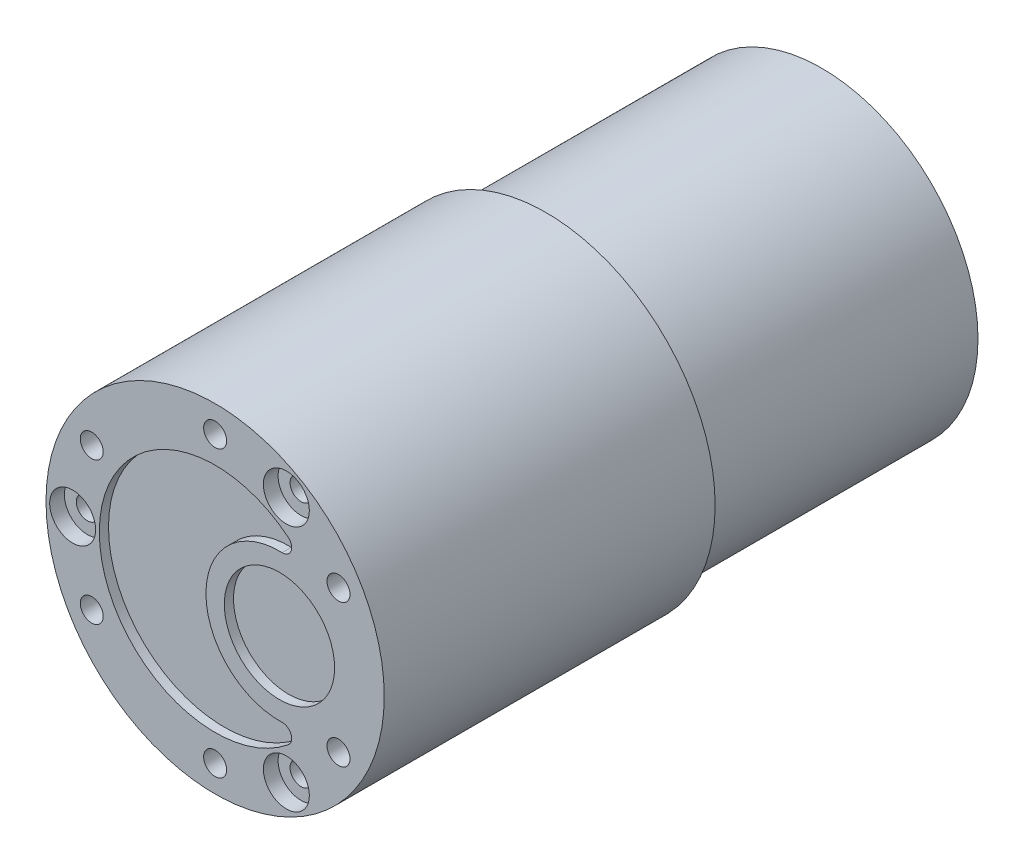
ISO-10303-21;
HEADER;
FILE_DESCRIPTION(('STEP AP214'),'2;1');
FILE_NAME('part.step','',(''),(''),'','','');
FILE_SCHEMA(('AUTOMOTIVE_DESIGN { 1 0 10303 214 1 1 1 1 }'));
ENDSEC;
DATA;
#1=APPLICATION_CONTEXT('core data for automotive mechanical design processes');
#2=APPLICATION_PROTOCOL_DEFINITION('international standard','automotive_design',2000,#1);
#3=PRODUCT_CONTEXT('',#1,'mechanical');
#4=PRODUCT('Part','Part','',(#3));
#5=PRODUCT_RELATED_PRODUCT_CATEGORY('part','',(#4));
#6=PRODUCT_DEFINITION_FORMATION('','',#4);
#7=PRODUCT_DEFINITION_CONTEXT('part definition',#1,'design');
#8=PRODUCT_DEFINITION('design','',#6,#7);
#9=PRODUCT_DEFINITION_SHAPE('','',#8);
#10=(LENGTH_UNIT() NAMED_UNIT(*) SI_UNIT(.MILLI.,.METRE.));
#11=(NAMED_UNIT(*) PLANE_ANGLE_UNIT() SI_UNIT($,.RADIAN.));
#12=(NAMED_UNIT(*) SI_UNIT($,.STERADIAN.) SOLID_ANGLE_UNIT());
#13=UNCERTAINTY_MEASURE_WITH_UNIT(LENGTH_MEASURE(1.E-05),#10,'distance_accuracy_value','');
#14=(GEOMETRIC_REPRESENTATION_CONTEXT(3) GLOBAL_UNCERTAINTY_ASSIGNED_CONTEXT((#13)) GLOBAL_UNIT_ASSIGNED_CONTEXT((#10,
#11,#12)) REPRESENTATION_CONTEXT('',''));
#15=CARTESIAN_POINT('',(0.,0.,0.));
#16=DIRECTION('',(0.,0.,1.));
#17=DIRECTION('',(1.,0.,0.));
#18=AXIS2_PLACEMENT_3D('',#15,#16,#17);
#19=CARTESIAN_POINT('',(0.,18.4,33.5));
#20=DIRECTION('',(0.,0.,-1.));
#21=DIRECTION('',(-1.,0.,0.));
#22=AXIS2_PLACEMENT_3D('',#19,#20,#21);
#23=PLANE('',#22);
#24=CARTESIAN_POINT('',(7.,0.,33.5));
#25=DIRECTION('',(0.,0.,1.));
#26=DIRECTION('',(1.,0.,0.));
#27=AXIS2_PLACEMENT_3D('',#24,#25,#26);
#28=CIRCLE('',#27,6.);
#29=CARTESIAN_POINT('',(13.,0.,33.5));
#30=VERTEX_POINT('',#29);
#31=EDGE_CURVE('E133',#30,#30,#28,.T.);
#32=ORIENTED_EDGE('',*,*,#31,.F.);
#33=EDGE_LOOP('',(#32));
#34=FACE_BOUND('',#33,.T.);
#35=CARTESIAN_POINT('',(0.,0.,33.5));
#36=DIRECTION('',(0.,0.,1.));
#37=DIRECTION('',(1.,0.,0.));
#38=AXIS2_PLACEMENT_3D('',#35,#36,#37);
#39=CIRCLE('',#38,12.6);
#40=CARTESIAN_POINT('',(7.95724137931039,9.76945800090215,33.5));
#41=VERTEX_POINT('',#40);
#42=CARTESIAN_POINT('',(7.95724137931039,-9.76945800090215,33.5));
#43=VERTEX_POINT('',#42);
#44=EDGE_CURVE('E139',#41,#43,#39,.T.);
#45=ORIENTED_EDGE('',*,*,#44,.F.);
#46=CARTESIAN_POINT('',(7.32571428571432,8.99410419130675,33.5));
#47=DIRECTION('',(0.,0.,1.));
#48=DIRECTION('',(1.,0.,0.));
#49=AXIS2_PLACEMENT_3D('',#46,#47,#48);
#50=CIRCLE('',#49,1.);
#51=CARTESIAN_POINT('',(7.28952380952385,7.99475928116155,33.5));
#52=VERTEX_POINT('',#51);
#53=EDGE_CURVE('E57',#52,#41,#50,.T.);
#54=ORIENTED_EDGE('',*,*,#53,.F.);
#55=CARTESIAN_POINT('',(7.,0.,33.5));
#56=DIRECTION('',(0.,0.,-1.));
#57=DIRECTION('',(-1.,0.,0.));
#58=AXIS2_PLACEMENT_3D('',#55,#56,#57);
#59=CIRCLE('',#58,8.);
#60=CARTESIAN_POINT('',(7.28952380952385,-7.99475928116155,33.5));
#61=VERTEX_POINT('',#60);
#62=EDGE_CURVE('E127',#61,#52,#59,.T.);
#63=ORIENTED_EDGE('',*,*,#62,.F.);
#64=CARTESIAN_POINT('',(7.32571428571432,-8.99410419130675,33.5));
#65=DIRECTION('',(0.,0.,1.));
#66=DIRECTION('',(1.,0.,0.));
#67=AXIS2_PLACEMENT_3D('',#64,#65,#66);
#68=CIRCLE('',#67,1.);
#69=EDGE_CURVE('E130',#43,#61,#68,.T.);
#70=ORIENTED_EDGE('',*,*,#69,.F.);
#71=EDGE_LOOP('',(#45,#54,#63,#70));
#72=FACE_BOUND('',#71,.T.);
#73=CARTESIAN_POINT('',(-15.5,0.,33.5));
#74=DIRECTION('',(0.,0.,1.));
#75=DIRECTION('',(1.,0.,0.));
#76=AXIS2_PLACEMENT_3D('',#73,#74,#75);
#77=CIRCLE('',#76,2.5);
#78=CARTESIAN_POINT('',(-13.,0.,33.5));
#79=VERTEX_POINT('',#78);
#80=EDGE_CURVE('E146',#79,#79,#77,.T.);
#81=ORIENTED_EDGE('',*,*,#80,.F.);
#82=EDGE_LOOP('',(#81));
#83=FACE_BOUND('',#82,.T.);
#84=CARTESIAN_POINT('',(7.75000000000001,13.4233937586588,33.5));
#85=DIRECTION('',(0.,0.,1.));
#86=DIRECTION('',(1.,0.,0.));
#87=AXIS2_PLACEMENT_3D('',#84,#85,#86);
#88=CIRCLE('',#87,2.5);
#89=CARTESIAN_POINT('',(10.25,13.4233937586588,33.5));
#90=VERTEX_POINT('',#89);
#91=EDGE_CURVE('E161',#90,#90,#88,.T.);
#92=ORIENTED_EDGE('',*,*,#91,.F.);
#93=EDGE_LOOP('',(#92));
#94=FACE_BOUND('',#93,.T.);
#95=CARTESIAN_POINT('',(7.75,-13.4233937586588,33.5));
#96=DIRECTION('',(0.,0.,1.));
#97=DIRECTION('',(1.,0.,0.));
#98=AXIS2_PLACEMENT_3D('',#95,#96,#97);
#99=CIRCLE('',#98,2.5);
#100=CARTESIAN_POINT('',(10.25,-13.4233937586588,33.5));
#101=VERTEX_POINT('',#100);
#102=EDGE_CURVE('E173',#101,#101,#99,.T.);
#103=ORIENTED_EDGE('',*,*,#102,.F.);
#104=EDGE_LOOP('',(#103));
#105=FACE_BOUND('',#104,.T.);
#106=CARTESIAN_POINT('',(0.,15.5,33.5));
#107=DIRECTION('',(0.,0.,1.));
#108=DIRECTION('',(1.,0.,0.));
#109=AXIS2_PLACEMENT_3D('',#106,#107,#108);
#110=CIRCLE('',#109,1.25);
#111=CARTESIAN_POINT('',(1.24999999999999,15.5,33.5));
#112=VERTEX_POINT('',#111);
#113=EDGE_CURVE('E185',#112,#112,#110,.T.);
#114=ORIENTED_EDGE('',*,*,#113,.F.);
#115=EDGE_LOOP('',(#114));
#116=FACE_BOUND('',#115,.T.);
#117=CARTESIAN_POINT('',(0.,-15.5,33.5));
#118=DIRECTION('',(0.,0.,1.));
#119=DIRECTION('',(1.,0.,0.));
#120=AXIS2_PLACEMENT_3D('',#117,#118,#119);
#121=CIRCLE('',#120,1.25);
#122=CARTESIAN_POINT('',(1.25,-15.5,33.5));
#123=VERTEX_POINT('',#122);
#124=EDGE_CURVE('E191',#123,#123,#121,.T.);
#125=ORIENTED_EDGE('',*,*,#124,.F.);
#126=EDGE_LOOP('',(#125));
#127=FACE_BOUND('',#126,.T.);
#128=CARTESIAN_POINT('',(13.4233937586588,-7.75000000000001,33.5));
#129=DIRECTION('',(0.,0.,1.));
#130=DIRECTION('',(1.,0.,0.));
#131=AXIS2_PLACEMENT_3D('',#128,#129,#130);
#132=CIRCLE('',#131,1.25);
#133=CARTESIAN_POINT('',(14.6733937586588,-7.75000000000001,33.5));
#134=VERTEX_POINT('',#133);
#135=EDGE_CURVE('E197',#134,#134,#132,.T.);
#136=ORIENTED_EDGE('',*,*,#135,.F.);
#137=EDGE_LOOP('',(#136));
#138=FACE_BOUND('',#137,.T.);
#139=CARTESIAN_POINT('',(13.4233937586588,7.75,33.5));
#140=DIRECTION('',(0.,0.,1.));
#141=DIRECTION('',(1.,0.,0.));
#142=AXIS2_PLACEMENT_3D('',#139,#140,#141);
#143=CIRCLE('',#142,1.25);
#144=CARTESIAN_POINT('',(14.6733937586588,7.75,33.5));
#145=VERTEX_POINT('',#144);
#146=EDGE_CURVE('E203',#145,#145,#143,.T.);
#147=ORIENTED_EDGE('',*,*,#146,.F.);
#148=EDGE_LOOP('',(#147));
#149=FACE_BOUND('',#148,.T.);
#150=CARTESIAN_POINT('',(-13.4233937586588,7.75000000000001,33.5));
#151=DIRECTION('',(0.,0.,1.));
#152=DIRECTION('',(1.,0.,0.));
#153=AXIS2_PLACEMENT_3D('',#150,#151,#152);
#154=CIRCLE('',#153,1.25);
#155=CARTESIAN_POINT('',(-12.1733937586588,7.75000000000001,33.5));
#156=VERTEX_POINT('',#155);
#157=EDGE_CURVE('E209',#156,#156,#154,.T.);
#158=ORIENTED_EDGE('',*,*,#157,.F.);
#159=EDGE_LOOP('',(#158));
#160=FACE_BOUND('',#159,.T.);
#161=CARTESIAN_POINT('',(-13.4233937586588,-7.75,33.5));
#162=DIRECTION('',(0.,0.,1.));
#163=DIRECTION('',(1.,0.,0.));
#164=AXIS2_PLACEMENT_3D('',#161,#162,#163);
#165=CIRCLE('',#164,1.25);
#166=CARTESIAN_POINT('',(-12.1733937586588,-7.75,33.5));
#167=VERTEX_POINT('',#166);
#168=EDGE_CURVE('E215',#167,#167,#165,.T.);
#169=ORIENTED_EDGE('',*,*,#168,.F.);
#170=EDGE_LOOP('',(#169));
#171=FACE_BOUND('',#170,.T.);
#172=CARTESIAN_POINT('',(0.,0.,33.5));
#173=DIRECTION('',(0.,0.,1.));
#174=DIRECTION('',(1.,0.,0.));
#175=AXIS2_PLACEMENT_3D('',#172,#173,#174);
#176=CIRCLE('',#175,18.4);
#177=CARTESIAN_POINT('',(18.4,0.,33.5));
#178=VERTEX_POINT('',#177);
#179=EDGE_CURVE('E221',#178,#178,#176,.T.);
#180=ORIENTED_EDGE('',*,*,#179,.T.);
#181=EDGE_LOOP('',(#180));
#182=FACE_BOUND('',#181,.T.);
#183=ADVANCED_FACE('F43',(#34,#72,#83,#94,#105,#116,#127,#138,#149,#160,#171,#182),#23,.F.);
#184=CARTESIAN_POINT('',(0.,5.,-33.5));
#185=DIRECTION('',(0.,0.,1.));
#186=DIRECTION('',(1.,0.,0.));
#187=AXIS2_PLACEMENT_3D('',#184,#185,#186);
#188=PLANE('',#187);
#189=CARTESIAN_POINT('',(0.,0.,-33.5));
#190=DIRECTION('',(0.,0.,1.));
#191=DIRECTION('',(1.,0.,0.));
#192=AXIS2_PLACEMENT_3D('',#189,#190,#191);
#193=CIRCLE('',#192,5.);
#194=CARTESIAN_POINT('',(5.,0.,-33.5));
#195=VERTEX_POINT('',#194);
#196=EDGE_CURVE('E11',#195,#195,#193,.T.);
#197=ORIENTED_EDGE('',*,*,#196,.F.);
#198=EDGE_LOOP('',(#197));
#199=FACE_BOUND('',#198,.T.);
#200=ADVANCED_FACE('F240',(#199),#188,.F.);
#201=CARTESIAN_POINT('',(0.,0.,-33.5));
#202=DIRECTION('',(0.,0.,1.));
#203=DIRECTION('',(1.,0.,0.));
#204=AXIS2_PLACEMENT_3D('',#201,#202,#203);
#205=CONICAL_SURFACE('',#204,5.,0.785398163397448);
#206=CARTESIAN_POINT('',(0.,0.,-32.5));
#207=DIRECTION('',(0.,0.,1.));
#208=DIRECTION('',(1.,0.,0.));
#209=AXIS2_PLACEMENT_3D('',#206,#207,#208);
#210=CIRCLE('',#209,6.);
#211=CARTESIAN_POINT('',(6.,0.,-32.5));
#212=VERTEX_POINT('',#211);
#213=EDGE_CURVE('E50',#212,#212,#210,.T.);
#214=ORIENTED_EDGE('',*,*,#213,.F.);
#215=EDGE_LOOP('',(#214));
#216=FACE_BOUND('',#215,.T.);
#217=ORIENTED_EDGE('',*,*,#196,.T.);
#218=EDGE_LOOP('',(#217));
#219=FACE_BOUND('',#218,.T.);
#220=ADVANCED_FACE('F237',(#216,#219),#205,.T.);
#221=CARTESIAN_POINT('',(0.,17.,-32.5));
#222=DIRECTION('',(0.,0.,1.));
#223=DIRECTION('',(1.,0.,0.));
#224=AXIS2_PLACEMENT_3D('',#221,#222,#223);
#225=PLANE('',#224);
#226=CARTESIAN_POINT('',(0.,0.,-32.5));
#227=DIRECTION('',(0.,0.,1.));
#228=DIRECTION('',(1.,0.,0.));
#229=AXIS2_PLACEMENT_3D('',#226,#227,#228);
#230=CIRCLE('',#229,17.);
#231=CARTESIAN_POINT('',(17.,0.,-32.5));
#232=VERTEX_POINT('',#231);
#233=EDGE_CURVE('E230',#232,#232,#230,.T.);
#234=ORIENTED_EDGE('',*,*,#233,.F.);
#235=EDGE_LOOP('',(#234));
#236=FACE_BOUND('',#235,.T.);
#237=ORIENTED_EDGE('',*,*,#213,.T.);
#238=EDGE_LOOP('',(#237));
#239=FACE_BOUND('',#238,.T.);
#240=ADVANCED_FACE('F235',(#236,#239),#225,.F.);
#241=CARTESIAN_POINT('',(0.,0.,33.5));
#242=DIRECTION('',(0.,0.,1.));
#243=DIRECTION('',(1.,0.,0.));
#244=AXIS2_PLACEMENT_3D('',#241,#242,#243);
#245=CYLINDRICAL_SURFACE('',#244,17.);
#246=CARTESIAN_POINT('',(0.,0.,-2.5));
#247=DIRECTION('',(0.,0.,1.));
#248=DIRECTION('',(1.,0.,0.));
#249=AXIS2_PLACEMENT_3D('',#246,#247,#248);
#250=CIRCLE('',#249,17.);
#251=CARTESIAN_POINT('',(17.,0.,-2.5));
#252=VERTEX_POINT('',#251);
#253=EDGE_CURVE('E227',#252,#252,#250,.T.);
#254=ORIENTED_EDGE('',*,*,#253,.F.);
#255=EDGE_LOOP('',(#254));
#256=FACE_BOUND('',#255,.T.);
#257=ORIENTED_EDGE('',*,*,#233,.T.);
#258=EDGE_LOOP('',(#257));
#259=FACE_BOUND('',#258,.T.);
#260=ADVANCED_FACE('F252',(#256,#259),#245,.T.);
#261=CARTESIAN_POINT('',(0.,17.,-2.5));
#262=DIRECTION('',(0.,0.,1.));
#263=DIRECTION('',(1.,0.,0.));
#264=AXIS2_PLACEMENT_3D('',#261,#262,#263);
#265=PLANE('',#264);
#266=CARTESIAN_POINT('',(0.,0.,-2.5));
#267=DIRECTION('',(0.,0.,1.));
#268=DIRECTION('',(1.,0.,0.));
#269=AXIS2_PLACEMENT_3D('',#266,#267,#268);
#270=CIRCLE('',#269,18.4);
#271=CARTESIAN_POINT('',(18.4,0.,-2.5));
#272=VERTEX_POINT('',#271);
#273=EDGE_CURVE('E224',#272,#272,#270,.T.);
#274=ORIENTED_EDGE('',*,*,#273,.F.);
#275=EDGE_LOOP('',(#274));
#276=FACE_BOUND('',#275,.T.);
#277=ORIENTED_EDGE('',*,*,#253,.T.);
#278=EDGE_LOOP('',(#277));
#279=FACE_BOUND('',#278,.T.);
#280=ADVANCED_FACE('F256',(#276,#279),#265,.F.);
#281=CARTESIAN_POINT('',(0.,0.,33.5));
#282=DIRECTION('',(0.,0.,1.));
#283=DIRECTION('',(1.,0.,0.));
#284=AXIS2_PLACEMENT_3D('',#281,#282,#283);
#285=CYLINDRICAL_SURFACE('',#284,18.4);
#286=ORIENTED_EDGE('',*,*,#179,.F.);
#287=EDGE_LOOP('',(#286));
#288=FACE_BOUND('',#287,.T.);
#289=ORIENTED_EDGE('',*,*,#273,.T.);
#290=EDGE_LOOP('',(#289));
#291=FACE_BOUND('',#290,.T.);
#292=ADVANCED_FACE('F260',(#288,#291),#285,.T.);
#293=CARTESIAN_POINT('',(-13.4233937586588,-7.75,25.));
#294=DIRECTION('',(0.,0.,1.));
#295=DIRECTION('',(1.,0.,0.));
#296=AXIS2_PLACEMENT_3D('',#293,#294,#295);
#297=CONICAL_SURFACE('',#296,1.25,1.02974425867665);
#298=CARTESIAN_POINT('',(-13.4233937586588,-7.75,24.2489242262155));
#299=VERTEX_POINT('',#298);
#300=VERTEX_LOOP('',#299);
#301=FACE_BOUND('',#300,.T.);
#302=CARTESIAN_POINT('',(-13.4233937586588,-7.75,25.));
#303=DIRECTION('',(0.,0.,1.));
#304=DIRECTION('',(1.,0.,0.));
#305=AXIS2_PLACEMENT_3D('',#302,#303,#304);
#306=CIRCLE('',#305,1.25);
#307=CARTESIAN_POINT('',(-12.1733937586588,-7.75,25.));
#308=VERTEX_POINT('',#307);
#309=EDGE_CURVE('E218',#308,#308,#306,.T.);
#310=ORIENTED_EDGE('',*,*,#309,.T.);
#311=EDGE_LOOP('',(#310));
#312=FACE_BOUND('',#311,.T.);
#313=ADVANCED_FACE('F264',(#301,#312),#297,.F.);
#314=CARTESIAN_POINT('',(-13.4233937586588,-7.75,33.5));
#315=DIRECTION('',(0.,0.,1.));
#316=DIRECTION('',(1.,0.,0.));
#317=AXIS2_PLACEMENT_3D('',#314,#315,#316);
#318=CYLINDRICAL_SURFACE('',#317,1.25);
#319=ORIENTED_EDGE('',*,*,#309,.F.);
#320=EDGE_LOOP('',(#319));
#321=FACE_BOUND('',#320,.T.);
#322=ORIENTED_EDGE('',*,*,#168,.T.);
#323=EDGE_LOOP('',(#322));
#324=FACE_BOUND('',#323,.T.);
#325=ADVANCED_FACE('F268',(#321,#324),#318,.F.);
#326=CARTESIAN_POINT('',(-13.4233937586588,7.75000000000001,25.));
#327=DIRECTION('',(0.,0.,1.));
#328=DIRECTION('',(1.,0.,0.));
#329=AXIS2_PLACEMENT_3D('',#326,#327,#328);
#330=CONICAL_SURFACE('',#329,1.25,1.02974425867665);
#331=CARTESIAN_POINT('',(-13.4233937586588,7.75000000000001,24.2489242262155));
#332=VERTEX_POINT('',#331);
#333=VERTEX_LOOP('',#332);
#334=FACE_BOUND('',#333,.T.);
#335=CARTESIAN_POINT('',(-13.4233937586588,7.75000000000001,25.));
#336=DIRECTION('',(0.,0.,1.));
#337=DIRECTION('',(1.,0.,0.));
#338=AXIS2_PLACEMENT_3D('',#335,#336,#337);
#339=CIRCLE('',#338,1.25);
#340=CARTESIAN_POINT('',(-12.1733937586588,7.75000000000001,25.));
#341=VERTEX_POINT('',#340);
#342=EDGE_CURVE('E212',#341,#341,#339,.T.);
#343=ORIENTED_EDGE('',*,*,#342,.T.);
#344=EDGE_LOOP('',(#343));
#345=FACE_BOUND('',#344,.T.);
#346=ADVANCED_FACE('F271',(#334,#345),#330,.F.);
#347=CARTESIAN_POINT('',(-13.4233937586588,7.75000000000001,33.5));
#348=DIRECTION('',(0.,0.,1.));
#349=DIRECTION('',(1.,0.,0.));
#350=AXIS2_PLACEMENT_3D('',#347,#348,#349);
#351=CYLINDRICAL_SURFACE('',#350,1.25);
#352=ORIENTED_EDGE('',*,*,#342,.F.);
#353=EDGE_LOOP('',(#352));
#354=FACE_BOUND('',#353,.T.);
#355=ORIENTED_EDGE('',*,*,#157,.T.);
#356=EDGE_LOOP('',(#355));
#357=FACE_BOUND('',#356,.T.);
#358=ADVANCED_FACE('F275',(#354,#357),#351,.F.);
#359=CARTESIAN_POINT('',(13.4233937586588,7.75,25.));
#360=DIRECTION('',(0.,0.,1.));
#361=DIRECTION('',(1.,0.,0.));
#362=AXIS2_PLACEMENT_3D('',#359,#360,#361);
#363=CONICAL_SURFACE('',#362,1.25,1.02974425867665);
#364=CARTESIAN_POINT('',(13.4233937586588,7.75,24.2489242262155));
#365=VERTEX_POINT('',#364);
#366=VERTEX_LOOP('',#365);
#367=FACE_BOUND('',#366,.T.);
#368=CARTESIAN_POINT('',(13.4233937586588,7.75,25.));
#369=DIRECTION('',(0.,0.,1.));
#370=DIRECTION('',(1.,0.,0.));
#371=AXIS2_PLACEMENT_3D('',#368,#369,#370);
#372=CIRCLE('',#371,1.25);
#373=CARTESIAN_POINT('',(14.6733937586588,7.75,25.));
#374=VERTEX_POINT('',#373);
#375=EDGE_CURVE('E206',#374,#374,#372,.T.);
#376=ORIENTED_EDGE('',*,*,#375,.T.);
#377=EDGE_LOOP('',(#376));
#378=FACE_BOUND('',#377,.T.);
#379=ADVANCED_FACE('F279',(#367,#378),#363,.F.);
#380=CARTESIAN_POINT('',(13.4233937586588,7.75,33.5));
#381=DIRECTION('',(0.,0.,1.));
#382=DIRECTION('',(1.,0.,0.));
#383=AXIS2_PLACEMENT_3D('',#380,#381,#382);
#384=CYLINDRICAL_SURFACE('',#383,1.25);
#385=ORIENTED_EDGE('',*,*,#375,.F.);
#386=EDGE_LOOP('',(#385));
#387=FACE_BOUND('',#386,.T.);
#388=ORIENTED_EDGE('',*,*,#146,.T.);
#389=EDGE_LOOP('',(#388));
#390=FACE_BOUND('',#389,.T.);
#391=ADVANCED_FACE('F283',(#387,#390),#384,.F.);
#392=CARTESIAN_POINT('',(13.4233937586588,-7.75000000000001,25.));
#393=DIRECTION('',(0.,0.,1.));
#394=DIRECTION('',(1.,0.,0.));
#395=AXIS2_PLACEMENT_3D('',#392,#393,#394);
#396=CONICAL_SURFACE('',#395,1.25,1.02974425867665);
#397=CARTESIAN_POINT('',(13.4233937586588,-7.75000000000001,24.2489242262155));
#398=VERTEX_POINT('',#397);
#399=VERTEX_LOOP('',#398);
#400=FACE_BOUND('',#399,.T.);
#401=CARTESIAN_POINT('',(13.4233937586588,-7.75000000000001,25.));
#402=DIRECTION('',(0.,0.,1.));
#403=DIRECTION('',(1.,0.,0.));
#404=AXIS2_PLACEMENT_3D('',#401,#402,#403);
#405=CIRCLE('',#404,1.25);
#406=CARTESIAN_POINT('',(14.6733937586588,-7.75000000000001,25.));
#407=VERTEX_POINT('',#406);
#408=EDGE_CURVE('E200',#407,#407,#405,.T.);
#409=ORIENTED_EDGE('',*,*,#408,.T.);
#410=EDGE_LOOP('',(#409));
#411=FACE_BOUND('',#410,.T.);
#412=ADVANCED_FACE('F287',(#400,#411),#396,.F.);
#413=CARTESIAN_POINT('',(13.4233937586588,-7.75000000000001,33.5));
#414=DIRECTION('',(0.,0.,1.));
#415=DIRECTION('',(1.,0.,0.));
#416=AXIS2_PLACEMENT_3D('',#413,#414,#415);
#417=CYLINDRICAL_SURFACE('',#416,1.25);
#418=ORIENTED_EDGE('',*,*,#408,.F.);
#419=EDGE_LOOP('',(#418));
#420=FACE_BOUND('',#419,.T.);
#421=ORIENTED_EDGE('',*,*,#135,.T.);
#422=EDGE_LOOP('',(#421));
#423=FACE_BOUND('',#422,.T.);
#424=ADVANCED_FACE('F291',(#420,#423),#417,.F.);
#425=CARTESIAN_POINT('',(0.,-15.5,25.));
#426=DIRECTION('',(0.,0.,1.));
#427=DIRECTION('',(1.,0.,0.));
#428=AXIS2_PLACEMENT_3D('',#425,#426,#427);
#429=CONICAL_SURFACE('',#428,1.25,1.02974425867665);
#430=CARTESIAN_POINT('',(0.,-15.5,24.2489242262155));
#431=VERTEX_POINT('',#430);
#432=VERTEX_LOOP('',#431);
#433=FACE_BOUND('',#432,.T.);
#434=CARTESIAN_POINT('',(0.,-15.5,25.));
#435=DIRECTION('',(0.,0.,1.));
#436=DIRECTION('',(1.,0.,0.));
#437=AXIS2_PLACEMENT_3D('',#434,#435,#436);
#438=CIRCLE('',#437,1.25);
#439=CARTESIAN_POINT('',(1.25,-15.5,25.));
#440=VERTEX_POINT('',#439);
#441=EDGE_CURVE('E194',#440,#440,#438,.T.);
#442=ORIENTED_EDGE('',*,*,#441,.T.);
#443=EDGE_LOOP('',(#442));
#444=FACE_BOUND('',#443,.T.);
#445=ADVANCED_FACE('F295',(#433,#444),#429,.F.);
#446=CARTESIAN_POINT('',(0.,-15.5,33.5));
#447=DIRECTION('',(0.,0.,1.));
#448=DIRECTION('',(1.,0.,0.));
#449=AXIS2_PLACEMENT_3D('',#446,#447,#448);
#450=CYLINDRICAL_SURFACE('',#449,1.25);
#451=ORIENTED_EDGE('',*,*,#441,.F.);
#452=EDGE_LOOP('',(#451));
#453=FACE_BOUND('',#452,.T.);
#454=ORIENTED_EDGE('',*,*,#124,.T.);
#455=EDGE_LOOP('',(#454));
#456=FACE_BOUND('',#455,.T.);
#457=ADVANCED_FACE('F299',(#453,#456),#450,.F.);
#458=CARTESIAN_POINT('',(0.,15.5,25.));
#459=DIRECTION('',(0.,0.,1.));
#460=DIRECTION('',(1.,0.,0.));
#461=AXIS2_PLACEMENT_3D('',#458,#459,#460);
#462=CONICAL_SURFACE('',#461,1.25,1.02974425867665);
#463=CARTESIAN_POINT('',(0.,15.5,24.2489242262155));
#464=VERTEX_POINT('',#463);
#465=VERTEX_LOOP('',#464);
#466=FACE_BOUND('',#465,.T.);
#467=CARTESIAN_POINT('',(0.,15.5,25.));
#468=DIRECTION('',(0.,0.,1.));
#469=DIRECTION('',(1.,0.,0.));
#470=AXIS2_PLACEMENT_3D('',#467,#468,#469);
#471=CIRCLE('',#470,1.25);
#472=CARTESIAN_POINT('',(1.24999999999999,15.5,25.));
#473=VERTEX_POINT('',#472);
#474=EDGE_CURVE('E188',#473,#473,#471,.T.);
#475=ORIENTED_EDGE('',*,*,#474,.T.);
#476=EDGE_LOOP('',(#475));
#477=FACE_BOUND('',#476,.T.);
#478=ADVANCED_FACE('F303',(#466,#477),#462,.F.);
#479=CARTESIAN_POINT('',(0.,15.5,33.5));
#480=DIRECTION('',(0.,0.,1.));
#481=DIRECTION('',(1.,0.,0.));
#482=AXIS2_PLACEMENT_3D('',#479,#480,#481);
#483=CYLINDRICAL_SURFACE('',#482,1.25);
#484=ORIENTED_EDGE('',*,*,#474,.F.);
#485=EDGE_LOOP('',(#484));
#486=FACE_BOUND('',#485,.T.);
#487=ORIENTED_EDGE('',*,*,#113,.T.);
#488=EDGE_LOOP('',(#487));
#489=FACE_BOUND('',#488,.T.);
#490=ADVANCED_FACE('F307',(#486,#489),#483,.F.);
#491=CARTESIAN_POINT('',(7.75,-13.4233937586588,28.5));
#492=DIRECTION('',(0.,0.,1.));
#493=DIRECTION('',(1.,0.,0.));
#494=AXIS2_PLACEMENT_3D('',#491,#492,#493);
#495=CONICAL_SURFACE('',#494,1.2,1.02974425867665);
#496=CARTESIAN_POINT('',(7.74999999999999,-13.4233937586588,27.7789672571669));
#497=VERTEX_POINT('',#496);
#498=VERTEX_LOOP('',#497);
#499=FACE_BOUND('',#498,.T.);
#500=CARTESIAN_POINT('',(7.75,-13.4233937586588,28.5));
#501=DIRECTION('',(0.,0.,1.));
#502=DIRECTION('',(1.,0.,0.));
#503=AXIS2_PLACEMENT_3D('',#500,#501,#502);
#504=CIRCLE('',#503,1.2);
#505=CARTESIAN_POINT('',(8.94999999999999,-13.4233937586588,28.5));
#506=VERTEX_POINT('',#505);
#507=EDGE_CURVE('E182',#506,#506,#504,.T.);
#508=ORIENTED_EDGE('',*,*,#507,.T.);
#509=EDGE_LOOP('',(#508));
#510=FACE_BOUND('',#509,.T.);
#511=ADVANCED_FACE('F311',(#499,#510),#495,.F.);
#512=CARTESIAN_POINT('',(7.75,-13.4233937586588,33.5));
#513=DIRECTION('',(0.,0.,1.));
#514=DIRECTION('',(1.,0.,0.));
#515=AXIS2_PLACEMENT_3D('',#512,#513,#514);
#516=CYLINDRICAL_SURFACE('',#515,1.2);
#517=ORIENTED_EDGE('',*,*,#507,.F.);
#518=EDGE_LOOP('',(#517));
#519=FACE_BOUND('',#518,.T.);
#520=CARTESIAN_POINT('',(7.75,-13.4233937586588,31.9));
#521=DIRECTION('',(0.,0.,1.));
#522=DIRECTION('',(1.,0.,0.));
#523=AXIS2_PLACEMENT_3D('',#520,#521,#522);
#524=CIRCLE('',#523,1.2);
#525=CARTESIAN_POINT('',(8.94999999999999,-13.4233937586588,31.9));
#526=VERTEX_POINT('',#525);
#527=EDGE_CURVE('E179',#526,#526,#524,.T.);
#528=ORIENTED_EDGE('',*,*,#527,.T.);
#529=EDGE_LOOP('',(#528));
#530=FACE_BOUND('',#529,.T.);
#531=ADVANCED_FACE('F315',(#519,#530),#516,.F.);
#532=CARTESIAN_POINT('',(8.94999999999999,-13.4233937586588,31.9));
#533=DIRECTION('',(0.,0.,-1.));
#534=DIRECTION('',(-1.,0.,0.));
#535=AXIS2_PLACEMENT_3D('',#532,#533,#534);
#536=PLANE('',#535);
#537=ORIENTED_EDGE('',*,*,#527,.F.);
#538=EDGE_LOOP('',(#537));
#539=FACE_BOUND('',#538,.T.);
#540=CARTESIAN_POINT('',(7.75,-13.4233937586588,31.9));
#541=DIRECTION('',(0.,0.,1.));
#542=DIRECTION('',(1.,0.,0.));
#543=AXIS2_PLACEMENT_3D('',#540,#541,#542);
#544=CIRCLE('',#543,2.5);
#545=CARTESIAN_POINT('',(10.25,-13.4233937586588,31.9));
#546=VERTEX_POINT('',#545);
#547=EDGE_CURVE('E176',#546,#546,#544,.T.);
#548=ORIENTED_EDGE('',*,*,#547,.T.);
#549=EDGE_LOOP('',(#548));
#550=FACE_BOUND('',#549,.T.);
#551=ADVANCED_FACE('F319',(#539,#550),#536,.F.);
#552=CARTESIAN_POINT('',(7.75,-13.4233937586588,33.5));
#553=DIRECTION('',(0.,0.,1.));
#554=DIRECTION('',(1.,0.,0.));
#555=AXIS2_PLACEMENT_3D('',#552,#553,#554);
#556=CYLINDRICAL_SURFACE('',#555,2.5);
#557=ORIENTED_EDGE('',*,*,#547,.F.);
#558=EDGE_LOOP('',(#557));
#559=FACE_BOUND('',#558,.T.);
#560=ORIENTED_EDGE('',*,*,#102,.T.);
#561=EDGE_LOOP('',(#560));
#562=FACE_BOUND('',#561,.T.);
#563=ADVANCED_FACE('F323',(#559,#562),#556,.F.);
#564=CARTESIAN_POINT('',(7.75000000000001,13.4233937586588,28.5));
#565=DIRECTION('',(0.,0.,1.));
#566=DIRECTION('',(1.,0.,0.));
#567=AXIS2_PLACEMENT_3D('',#564,#565,#566);
#568=CONICAL_SURFACE('',#567,1.2,1.02974425867665);
#569=CARTESIAN_POINT('',(7.75,13.4233937586588,27.7789672571669));
#570=VERTEX_POINT('',#569);
#571=VERTEX_LOOP('',#570);
#572=FACE_BOUND('',#571,.T.);
#573=CARTESIAN_POINT('',(7.75000000000001,13.4233937586588,28.5));
#574=DIRECTION('',(0.,0.,1.));
#575=DIRECTION('',(1.,0.,0.));
#576=AXIS2_PLACEMENT_3D('',#573,#574,#575);
#577=CIRCLE('',#576,1.2);
#578=CARTESIAN_POINT('',(8.95,13.4233937586588,28.5));
#579=VERTEX_POINT('',#578);
#580=EDGE_CURVE('E170',#579,#579,#577,.T.);
#581=ORIENTED_EDGE('',*,*,#580,.T.);
#582=EDGE_LOOP('',(#581));
#583=FACE_BOUND('',#582,.T.);
#584=ADVANCED_FACE('F327',(#572,#583),#568,.F.);
#585=CARTESIAN_POINT('',(7.75000000000001,13.4233937586588,33.5));
#586=DIRECTION('',(0.,0.,1.));
#587=DIRECTION('',(1.,0.,0.));
#588=AXIS2_PLACEMENT_3D('',#585,#586,#587);
#589=CYLINDRICAL_SURFACE('',#588,1.2);
#590=ORIENTED_EDGE('',*,*,#580,.F.);
#591=EDGE_LOOP('',(#590));
#592=FACE_BOUND('',#591,.T.);
#593=CARTESIAN_POINT('',(7.75000000000001,13.4233937586588,31.9));
#594=DIRECTION('',(0.,0.,1.));
#595=DIRECTION('',(1.,0.,0.));
#596=AXIS2_PLACEMENT_3D('',#593,#594,#595);
#597=CIRCLE('',#596,1.2);
#598=CARTESIAN_POINT('',(8.95,13.4233937586588,31.9));
#599=VERTEX_POINT('',#598);
#600=EDGE_CURVE('E167',#599,#599,#597,.T.);
#601=ORIENTED_EDGE('',*,*,#600,.T.);
#602=EDGE_LOOP('',(#601));
#603=FACE_BOUND('',#602,.T.);
#604=ADVANCED_FACE('F331',(#592,#603),#589,.F.);
#605=CARTESIAN_POINT('',(8.95,13.4233937586588,31.9));
#606=DIRECTION('',(0.,0.,-1.));
#607=DIRECTION('',(-1.,0.,0.));
#608=AXIS2_PLACEMENT_3D('',#605,#606,#607);
#609=PLANE('',#608);
#610=ORIENTED_EDGE('',*,*,#600,.F.);
#611=EDGE_LOOP('',(#610));
#612=FACE_BOUND('',#611,.T.);
#613=CARTESIAN_POINT('',(7.75000000000001,13.4233937586588,31.9));
#614=DIRECTION('',(0.,0.,1.));
#615=DIRECTION('',(1.,0.,0.));
#616=AXIS2_PLACEMENT_3D('',#613,#614,#615);
#617=CIRCLE('',#616,2.5);
#618=CARTESIAN_POINT('',(10.25,13.4233937586588,31.9));
#619=VERTEX_POINT('',#618);
#620=EDGE_CURVE('E164',#619,#619,#617,.T.);
#621=ORIENTED_EDGE('',*,*,#620,.T.);
#622=EDGE_LOOP('',(#621));
#623=FACE_BOUND('',#622,.T.);
#624=ADVANCED_FACE('F335',(#612,#623),#609,.F.);
#625=CARTESIAN_POINT('',(7.75000000000001,13.4233937586588,33.5));
#626=DIRECTION('',(0.,0.,1.));
#627=DIRECTION('',(1.,0.,0.));
#628=AXIS2_PLACEMENT_3D('',#625,#626,#627);
#629=CYLINDRICAL_SURFACE('',#628,2.5);
#630=ORIENTED_EDGE('',*,*,#620,.F.);
#631=EDGE_LOOP('',(#630));
#632=FACE_BOUND('',#631,.T.);
#633=ORIENTED_EDGE('',*,*,#91,.T.);
#634=EDGE_LOOP('',(#633));
#635=FACE_BOUND('',#634,.T.);
#636=ADVANCED_FACE('F339',(#632,#635),#629,.F.);
#637=CARTESIAN_POINT('',(-15.5,0.,28.5));
#638=DIRECTION('',(0.,0.,1.));
#639=DIRECTION('',(1.,0.,0.));
#640=AXIS2_PLACEMENT_3D('',#637,#638,#639);
#641=CONICAL_SURFACE('',#640,1.2,1.02974425867665);
#642=CARTESIAN_POINT('',(-15.5,0.,27.7789672571669));
#643=VERTEX_POINT('',#642);
#644=VERTEX_LOOP('',#643);
#645=FACE_BOUND('',#644,.T.);
#646=CARTESIAN_POINT('',(-15.5,0.,28.5));
#647=DIRECTION('',(0.,0.,1.));
#648=DIRECTION('',(1.,0.,0.));
#649=AXIS2_PLACEMENT_3D('',#646,#647,#648);
#650=CIRCLE('',#649,1.2);
#651=CARTESIAN_POINT('',(-14.3,0.,28.5));
#652=VERTEX_POINT('',#651);
#653=EDGE_CURVE('E158',#652,#652,#650,.T.);
#654=ORIENTED_EDGE('',*,*,#653,.T.);
#655=EDGE_LOOP('',(#654));
#656=FACE_BOUND('',#655,.T.);
#657=ADVANCED_FACE('F343',(#645,#656),#641,.F.);
#658=CARTESIAN_POINT('',(-15.5,0.,33.5));
#659=DIRECTION('',(0.,0.,1.));
#660=DIRECTION('',(1.,0.,0.));
#661=AXIS2_PLACEMENT_3D('',#658,#659,#660);
#662=CYLINDRICAL_SURFACE('',#661,1.2);
#663=ORIENTED_EDGE('',*,*,#653,.F.);
#664=EDGE_LOOP('',(#663));
#665=FACE_BOUND('',#664,.T.);
#666=CARTESIAN_POINT('',(-15.5,0.,31.9));
#667=DIRECTION('',(0.,0.,1.));
#668=DIRECTION('',(1.,0.,0.));
#669=AXIS2_PLACEMENT_3D('',#666,#667,#668);
#670=CIRCLE('',#669,1.2);
#671=CARTESIAN_POINT('',(-14.3,0.,31.9));
#672=VERTEX_POINT('',#671);
#673=EDGE_CURVE('E155',#672,#672,#670,.T.);
#674=ORIENTED_EDGE('',*,*,#673,.T.);
#675=EDGE_LOOP('',(#674));
#676=FACE_BOUND('',#675,.T.);
#677=ADVANCED_FACE('F347',(#665,#676),#662,.F.);
#678=CARTESIAN_POINT('',(-14.3,0.,31.9));
#679=DIRECTION('',(0.,0.,-1.));
#680=DIRECTION('',(-1.,0.,0.));
#681=AXIS2_PLACEMENT_3D('',#678,#679,#680);
#682=PLANE('',#681);
#683=ORIENTED_EDGE('',*,*,#673,.F.);
#684=EDGE_LOOP('',(#683));
#685=FACE_BOUND('',#684,.T.);
#686=CARTESIAN_POINT('',(-15.5,0.,31.9));
#687=DIRECTION('',(0.,0.,1.));
#688=DIRECTION('',(1.,0.,0.));
#689=AXIS2_PLACEMENT_3D('',#686,#687,#688);
#690=CIRCLE('',#689,2.5);
#691=CARTESIAN_POINT('',(-13.,0.,31.9));
#692=VERTEX_POINT('',#691);
#693=EDGE_CURVE('E152',#692,#692,#690,.T.);
#694=ORIENTED_EDGE('',*,*,#693,.T.);
#695=EDGE_LOOP('',(#694));
#696=FACE_BOUND('',#695,.T.);
#697=ADVANCED_FACE('F351',(#685,#696),#682,.F.);
#698=CARTESIAN_POINT('',(-15.5,0.,33.5));
#699=DIRECTION('',(0.,0.,1.));
#700=DIRECTION('',(1.,0.,0.));
#701=AXIS2_PLACEMENT_3D('',#698,#699,#700);
#702=CYLINDRICAL_SURFACE('',#701,2.5);
#703=ORIENTED_EDGE('',*,*,#693,.F.);
#704=EDGE_LOOP('',(#703));
#705=FACE_BOUND('',#704,.T.);
#706=ORIENTED_EDGE('',*,*,#80,.T.);
#707=EDGE_LOOP('',(#706));
#708=FACE_BOUND('',#707,.T.);
#709=ADVANCED_FACE('F355',(#705,#708),#702,.F.);
#710=CARTESIAN_POINT('',(7.32571428571432,8.99410419130675,32.5));
#711=DIRECTION('',(0.,0.,1.));
#712=DIRECTION('',(1.,0.,0.));
#713=AXIS2_PLACEMENT_3D('',#710,#711,#712);
#714=CYLINDRICAL_SURFACE('',#713,1.);
#715=ORIENTED_EDGE('',*,*,#53,.T.);
#716=DIRECTION('',(0.,0.,1.));
#717=VECTOR('',#716,1.);
#718=CARTESIAN_POINT('',(7.95724137931039,9.76945800090215,32.5));
#719=LINE('',#718,#717);
#720=CARTESIAN_POINT('',(7.95724137931039,9.76945800090215,32.5));
#721=VERTEX_POINT('',#720);
#722=EDGE_CURVE('E105',#721,#41,#719,.T.);
#723=ORIENTED_EDGE('',*,*,#722,.F.);
#724=CARTESIAN_POINT('',(7.32571428571432,8.99410419130675,32.5));
#725=DIRECTION('',(0.,0.,1.));
#726=DIRECTION('',(1.,0.,0.));
#727=AXIS2_PLACEMENT_3D('',#724,#725,#726);
#728=CIRCLE('',#727,1.);
#729=CARTESIAN_POINT('',(7.28952380952385,7.99475928116155,32.5));
#730=VERTEX_POINT('',#729);
#731=EDGE_CURVE('E109',#730,#721,#728,.T.);
#732=ORIENTED_EDGE('',*,*,#731,.F.);
#733=DIRECTION('',(0.,0.,1.));
#734=VECTOR('',#733,1.);
#735=CARTESIAN_POINT('',(7.28952380952385,7.99475928116155,32.5));
#736=LINE('',#735,#734);
#737=EDGE_CURVE('E144',#730,#52,#736,.T.);
#738=ORIENTED_EDGE('',*,*,#737,.T.);
#739=EDGE_LOOP('',(#715,#723,#732,#738));
#740=FACE_BOUND('',#739,.T.);
#741=ADVANCED_FACE('F107',(#740),#714,.F.);
#742=CARTESIAN_POINT('',(7.,0.,32.5));
#743=DIRECTION('',(0.,0.,1.));
#744=DIRECTION('',(1.,0.,0.));
#745=AXIS2_PLACEMENT_3D('',#742,#743,#744);
#746=CYLINDRICAL_SURFACE('',#745,8.);
#747=ORIENTED_EDGE('',*,*,#62,.T.);
#748=ORIENTED_EDGE('',*,*,#737,.F.);
#749=CARTESIAN_POINT('',(7.,0.,32.5));
#750=DIRECTION('',(0.,0.,-1.));
#751=DIRECTION('',(-1.,0.,0.));
#752=AXIS2_PLACEMENT_3D('',#749,#750,#751);
#753=CIRCLE('',#752,8.);
#754=CARTESIAN_POINT('',(7.28952380952385,-7.99475928116155,32.5));
#755=VERTEX_POINT('',#754);
#756=EDGE_CURVE('E115',#755,#730,#753,.T.);
#757=ORIENTED_EDGE('',*,*,#756,.F.);
#758=DIRECTION('',(0.,0.,1.));
#759=VECTOR('',#758,1.);
#760=CARTESIAN_POINT('',(7.28952380952385,-7.99475928116155,32.5));
#761=LINE('',#760,#759);
#762=EDGE_CURVE('E147',#755,#61,#761,.T.);
#763=ORIENTED_EDGE('',*,*,#762,.T.);
#764=EDGE_LOOP('',(#747,#748,#757,#763));
#765=FACE_BOUND('',#764,.T.);
#766=ADVANCED_FACE('F362',(#765),#746,.T.);
#767=CARTESIAN_POINT('',(7.32571428571432,-8.99410419130675,32.5));
#768=DIRECTION('',(0.,0.,1.));
#769=DIRECTION('',(1.,0.,0.));
#770=AXIS2_PLACEMENT_3D('',#767,#768,#769);
#771=CYLINDRICAL_SURFACE('',#770,1.);
#772=ORIENTED_EDGE('',*,*,#69,.T.);
#773=ORIENTED_EDGE('',*,*,#762,.F.);
#774=CARTESIAN_POINT('',(7.32571428571432,-8.99410419130675,32.5));
#775=DIRECTION('',(0.,0.,1.));
#776=DIRECTION('',(1.,0.,0.));
#777=AXIS2_PLACEMENT_3D('',#774,#775,#776);
#778=CIRCLE('',#777,1.);
#779=CARTESIAN_POINT('',(7.95724137931039,-9.76945800090215,32.5));
#780=VERTEX_POINT('',#779);
#781=EDGE_CURVE('E123',#780,#755,#778,.T.);
#782=ORIENTED_EDGE('',*,*,#781,.F.);
#783=DIRECTION('',(0.,0.,1.));
#784=VECTOR('',#783,1.);
#785=CARTESIAN_POINT('',(7.95724137931039,-9.76945800090215,32.5));
#786=LINE('',#785,#784);
#787=EDGE_CURVE('E114',#780,#43,#786,.T.);
#788=ORIENTED_EDGE('',*,*,#787,.T.);
#789=EDGE_LOOP('',(#772,#773,#782,#788));
#790=FACE_BOUND('',#789,.T.);
#791=ADVANCED_FACE('F365',(#790),#771,.F.);
#792=CARTESIAN_POINT('',(0.,0.,32.5));
#793=DIRECTION('',(0.,0.,1.));
#794=DIRECTION('',(1.,0.,0.));
#795=AXIS2_PLACEMENT_3D('',#792,#793,#794);
#796=CYLINDRICAL_SURFACE('',#795,12.6);
#797=ORIENTED_EDGE('',*,*,#44,.T.);
#798=ORIENTED_EDGE('',*,*,#787,.F.);
#799=CARTESIAN_POINT('',(0.,0.,32.5));
#800=DIRECTION('',(0.,0.,1.));
#801=DIRECTION('',(1.,0.,0.));
#802=AXIS2_PLACEMENT_3D('',#799,#800,#801);
#803=CIRCLE('',#802,12.6);
#804=EDGE_CURVE('E118',#721,#780,#803,.T.);
#805=ORIENTED_EDGE('',*,*,#804,.F.);
#806=ORIENTED_EDGE('',*,*,#722,.T.);
#807=EDGE_LOOP('',(#797,#798,#805,#806));
#808=FACE_BOUND('',#807,.T.);
#809=ADVANCED_FACE('F119',(#808),#796,.F.);
#810=CARTESIAN_POINT('',(3.66285714285716,4.49705209565337,32.5));
#811=DIRECTION('',(0.,0.,1.));
#812=DIRECTION('',(1.,0.,0.));
#813=AXIS2_PLACEMENT_3D('',#810,#811,#812);
#814=PLANE('',#813);
#815=ORIENTED_EDGE('',*,*,#731,.T.);
#816=ORIENTED_EDGE('',*,*,#804,.T.);
#817=ORIENTED_EDGE('',*,*,#781,.T.);
#818=ORIENTED_EDGE('',*,*,#756,.T.);
#819=EDGE_LOOP('',(#815,#816,#817,#818));
#820=FACE_BOUND('',#819,.T.);
#821=ADVANCED_FACE('F125',(#820),#814,.T.);
#822=CARTESIAN_POINT('',(7.,0.,32.5));
#823=DIRECTION('',(0.,0.,1.));
#824=DIRECTION('',(1.,0.,0.));
#825=AXIS2_PLACEMENT_3D('',#822,#823,#824);
#826=CYLINDRICAL_SURFACE('',#825,6.);
#827=CARTESIAN_POINT('',(7.,0.,32.5));
#828=DIRECTION('',(0.,0.,1.));
#829=DIRECTION('',(1.,0.,0.));
#830=AXIS2_PLACEMENT_3D('',#827,#828,#829);
#831=CIRCLE('',#830,6.);
#832=CARTESIAN_POINT('',(13.,0.,32.5));
#833=VERTEX_POINT('',#832);
#834=EDGE_CURVE('E140',#833,#833,#831,.T.);
#835=ORIENTED_EDGE('',*,*,#834,.F.);
#836=EDGE_LOOP('',(#835));
#837=FACE_BOUND('',#836,.T.);
#838=ORIENTED_EDGE('',*,*,#31,.T.);
#839=EDGE_LOOP('',(#838));
#840=FACE_BOUND('',#839,.T.);
#841=ADVANCED_FACE('F374',(#837,#840),#826,.F.);
#842=CARTESIAN_POINT('',(7.,0.,32.5));
#843=DIRECTION('',(0.,0.,1.));
#844=DIRECTION('',(1.,0.,0.));
#845=AXIS2_PLACEMENT_3D('',#842,#843,#844);
#846=PLANE('',#845);
#847=ORIENTED_EDGE('',*,*,#834,.T.);
#848=EDGE_LOOP('',(#847));
#849=FACE_BOUND('',#848,.T.);
#850=ADVANCED_FACE('F377',(#849),#846,.T.);
#851=CLOSED_SHELL('',(#183,#200,#220,#240,#260,#280,#292,#313,#325,#346,#358,#379,#391,#412,
#424,#445,#457,#478,#490,#511,#531,#551,#563,#584,#604,#624,#636,#657,#677,#697,#709,#741,#766,
#791,#809,#821,#841,#850));
#852=MANIFOLD_SOLID_BREP('B2',#851);
#853=ADVANCED_BREP_SHAPE_REPRESENTATION('',(#18,#852),#14);
#854=SHAPE_DEFINITION_REPRESENTATION(#9,#853);
ENDSEC;
END-ISO-10303-21;
